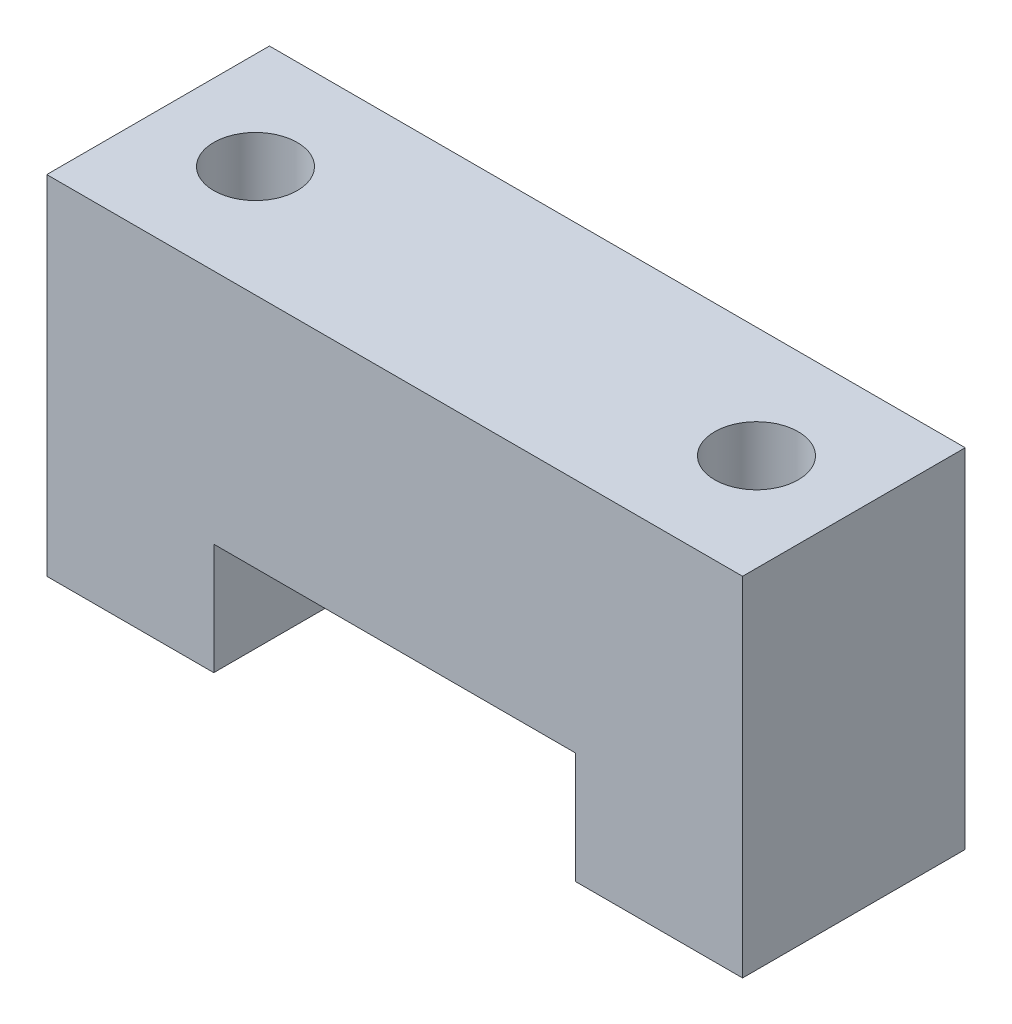
ISO-10303-21;
HEADER;
FILE_DESCRIPTION(('STEP AP214'),'2;1');
FILE_NAME('part.step','',(''),(''),'','','');
FILE_SCHEMA(('AUTOMOTIVE_DESIGN { 1 0 10303 214 1 1 1 1 }'));
ENDSEC;
DATA;
#1=APPLICATION_CONTEXT('core data for automotive mechanical design processes');
#2=APPLICATION_PROTOCOL_DEFINITION('international standard','automotive_design',2000,#1);
#3=PRODUCT_CONTEXT('',#1,'mechanical');
#4=PRODUCT('Part','Part','',(#3));
#5=PRODUCT_RELATED_PRODUCT_CATEGORY('part','',(#4));
#6=PRODUCT_DEFINITION_FORMATION('','',#4);
#7=PRODUCT_DEFINITION_CONTEXT('part definition',#1,'design');
#8=PRODUCT_DEFINITION('design','',#6,#7);
#9=PRODUCT_DEFINITION_SHAPE('','',#8);
#10=(LENGTH_UNIT() NAMED_UNIT(*) SI_UNIT(.MILLI.,.METRE.));
#11=(NAMED_UNIT(*) PLANE_ANGLE_UNIT() SI_UNIT($,.RADIAN.));
#12=(NAMED_UNIT(*) SI_UNIT($,.STERADIAN.) SOLID_ANGLE_UNIT());
#13=UNCERTAINTY_MEASURE_WITH_UNIT(LENGTH_MEASURE(1.E-05),#10,'distance_accuracy_value','');
#14=(GEOMETRIC_REPRESENTATION_CONTEXT(3) GLOBAL_UNCERTAINTY_ASSIGNED_CONTEXT((#13)) GLOBAL_UNIT_ASSIGNED_CONTEXT((#10,
#11,#12)) REPRESENTATION_CONTEXT('',''));
#15=CARTESIAN_POINT('',(0.,0.,0.));
#16=DIRECTION('',(0.,0.,1.));
#17=DIRECTION('',(1.,0.,0.));
#18=AXIS2_PLACEMENT_3D('',#15,#16,#17);
#19=CARTESIAN_POINT('',(0.,0.,0.));
#20=DIRECTION('',(0.,-1.,0.));
#21=DIRECTION('',(0.,0.,-1.));
#22=AXIS2_PLACEMENT_3D('',#19,#20,#21);
#23=PLANE('',#22);
#24=DIRECTION('',(0.,0.,-1.));
#25=VECTOR('',#24,1.);
#26=CARTESIAN_POINT('',(-13.,0.,0.));
#27=LINE('',#26,#25);
#28=CARTESIAN_POINT('',(-13.,0.,8.));
#29=VERTEX_POINT('',#28);
#30=CARTESIAN_POINT('',(-13.,0.,-8.));
#31=VERTEX_POINT('',#30);
#32=EDGE_CURVE('E11',#29,#31,#27,.T.);
#33=ORIENTED_EDGE('',*,*,#32,.F.);
#34=DIRECTION('',(1.,0.,0.));
#35=VECTOR('',#34,1.);
#36=CARTESIAN_POINT('',(-25.,0.,8.));
#37=LINE('',#36,#35);
#38=CARTESIAN_POINT('',(-25.,0.,8.));
#39=VERTEX_POINT('',#38);
#40=EDGE_CURVE('E146',#39,#29,#37,.T.);
#41=ORIENTED_EDGE('',*,*,#40,.F.);
#42=DIRECTION('',(0.,0.,1.));
#43=VECTOR('',#42,1.);
#44=CARTESIAN_POINT('',(-25.,0.,8.));
#45=LINE('',#44,#43);
#46=CARTESIAN_POINT('',(-25.,0.,-8.));
#47=VERTEX_POINT('',#46);
#48=EDGE_CURVE('E158',#47,#39,#45,.T.);
#49=ORIENTED_EDGE('',*,*,#48,.F.);
#50=DIRECTION('',(-1.,0.,0.));
#51=VECTOR('',#50,1.);
#52=CARTESIAN_POINT('',(-25.,0.,-8.));
#53=LINE('',#52,#51);
#54=EDGE_CURVE('E154',#31,#47,#53,.T.);
#55=ORIENTED_EDGE('',*,*,#54,.F.);
#56=EDGE_LOOP('',(#33,#41,#49,#55));
#57=FACE_BOUND('',#56,.T.);
#58=ADVANCED_FACE('F17',(#57),#23,.T.);
#59=CARTESIAN_POINT('',(25.,25.,8.));
#60=DIRECTION('',(-1.,0.,0.));
#61=DIRECTION('',(0.,0.,1.));
#62=AXIS2_PLACEMENT_3D('',#59,#60,#61);
#63=PLANE('',#62);
#64=DIRECTION('',(0.,0.,-1.));
#65=VECTOR('',#64,1.);
#66=CARTESIAN_POINT('',(25.,0.,8.));
#67=LINE('',#66,#65);
#68=CARTESIAN_POINT('',(25.,0.,8.));
#69=VERTEX_POINT('',#68);
#70=CARTESIAN_POINT('',(25.,0.,-8.));
#71=VERTEX_POINT('',#70);
#72=EDGE_CURVE('E141',#69,#71,#67,.T.);
#73=ORIENTED_EDGE('',*,*,#72,.T.);
#74=DIRECTION('',(0.,-1.,0.));
#75=VECTOR('',#74,1.);
#76=CARTESIAN_POINT('',(25.,25.,-8.));
#77=LINE('',#76,#75);
#78=CARTESIAN_POINT('',(25.,25.,-8.));
#79=VERTEX_POINT('',#78);
#80=EDGE_CURVE('E169',#79,#71,#77,.T.);
#81=ORIENTED_EDGE('',*,*,#80,.F.);
#82=DIRECTION('',(0.,0.,-1.));
#83=VECTOR('',#82,1.);
#84=CARTESIAN_POINT('',(25.,25.,8.));
#85=LINE('',#84,#83);
#86=CARTESIAN_POINT('',(25.,25.,8.));
#87=VERTEX_POINT('',#86);
#88=EDGE_CURVE('E144',#87,#79,#85,.T.);
#89=ORIENTED_EDGE('',*,*,#88,.F.);
#90=DIRECTION('',(0.,-1.,0.));
#91=VECTOR('',#90,1.);
#92=CARTESIAN_POINT('',(25.,25.,8.));
#93=LINE('',#92,#91);
#94=EDGE_CURVE('E151',#87,#69,#93,.T.);
#95=ORIENTED_EDGE('',*,*,#94,.T.);
#96=EDGE_LOOP('',(#73,#81,#89,#95));
#97=FACE_BOUND('',#96,.T.);
#98=ADVANCED_FACE('F19',(#97),#63,.F.);
#99=CARTESIAN_POINT('',(-25.,25.,-8.));
#100=DIRECTION('',(0.,0.,1.));
#101=DIRECTION('',(1.,0.,0.));
#102=AXIS2_PLACEMENT_3D('',#99,#100,#101);
#103=PLANE('',#102);
#104=DIRECTION('',(1.,0.,0.));
#105=VECTOR('',#104,1.);
#106=CARTESIAN_POINT('',(13.,8.,-8.));
#107=LINE('',#106,#105);
#108=CARTESIAN_POINT('',(-13.,8.,-8.));
#109=VERTEX_POINT('',#108);
#110=CARTESIAN_POINT('',(13.,8.,-8.));
#111=VERTEX_POINT('',#110);
#112=EDGE_CURVE('E135',#109,#111,#107,.T.);
#113=ORIENTED_EDGE('',*,*,#112,.F.);
#114=DIRECTION('',(0.,1.,0.));
#115=VECTOR('',#114,1.);
#116=CARTESIAN_POINT('',(-13.,8.,-8.));
#117=LINE('',#116,#115);
#118=EDGE_CURVE('E124',#31,#109,#117,.T.);
#119=ORIENTED_EDGE('',*,*,#118,.F.);
#120=ORIENTED_EDGE('',*,*,#54,.T.);
#121=DIRECTION('',(0.,-1.,0.));
#122=VECTOR('',#121,1.);
#123=CARTESIAN_POINT('',(-25.,25.,-8.));
#124=LINE('',#123,#122);
#125=CARTESIAN_POINT('',(-25.,25.,-8.));
#126=VERTEX_POINT('',#125);
#127=EDGE_CURVE('E166',#126,#47,#124,.T.);
#128=ORIENTED_EDGE('',*,*,#127,.F.);
#129=DIRECTION('',(-1.,0.,0.));
#130=VECTOR('',#129,1.);
#131=CARTESIAN_POINT('',(-25.,25.,-8.));
#132=LINE('',#131,#130);
#133=EDGE_CURVE('E70',#79,#126,#132,.T.);
#134=ORIENTED_EDGE('',*,*,#133,.F.);
#135=ORIENTED_EDGE('',*,*,#80,.T.);
#136=CARTESIAN_POINT('',(13.,0.,-8.));
#137=VERTEX_POINT('',#136);
#138=EDGE_CURVE('E155',#71,#137,#53,.T.);
#139=ORIENTED_EDGE('',*,*,#138,.T.);
#140=DIRECTION('',(0.,-1.,0.));
#141=VECTOR('',#140,1.);
#142=CARTESIAN_POINT('',(13.,8.,-8.));
#143=LINE('',#142,#141);
#144=EDGE_CURVE('E32',#111,#137,#143,.T.);
#145=ORIENTED_EDGE('',*,*,#144,.F.);
#146=EDGE_LOOP('',(#113,#119,#120,#128,#134,#135,#139,#145));
#147=FACE_BOUND('',#146,.T.);
#148=ADVANCED_FACE('F192',(#147),#103,.F.);
#149=CARTESIAN_POINT('',(-25.,25.,8.));
#150=DIRECTION('',(1.,0.,0.));
#151=DIRECTION('',(0.,0.,-1.));
#152=AXIS2_PLACEMENT_3D('',#149,#150,#151);
#153=PLANE('',#152);
#154=ORIENTED_EDGE('',*,*,#48,.T.);
#155=DIRECTION('',(0.,-1.,0.));
#156=VECTOR('',#155,1.);
#157=CARTESIAN_POINT('',(-25.,25.,8.));
#158=LINE('',#157,#156);
#159=CARTESIAN_POINT('',(-25.,25.,8.));
#160=VERTEX_POINT('',#159);
#161=EDGE_CURVE('E163',#160,#39,#158,.T.);
#162=ORIENTED_EDGE('',*,*,#161,.F.);
#163=DIRECTION('',(0.,0.,1.));
#164=VECTOR('',#163,1.);
#165=CARTESIAN_POINT('',(-25.,25.,8.));
#166=LINE('',#165,#164);
#167=EDGE_CURVE('E148',#126,#160,#166,.T.);
#168=ORIENTED_EDGE('',*,*,#167,.F.);
#169=ORIENTED_EDGE('',*,*,#127,.T.);
#170=EDGE_LOOP('',(#154,#162,#168,#169));
#171=FACE_BOUND('',#170,.T.);
#172=ADVANCED_FACE('F229',(#171),#153,.F.);
#173=CARTESIAN_POINT('',(-25.,25.,8.));
#174=DIRECTION('',(0.,0.,-1.));
#175=DIRECTION('',(-1.,0.,0.));
#176=AXIS2_PLACEMENT_3D('',#173,#174,#175);
#177=PLANE('',#176);
#178=ORIENTED_EDGE('',*,*,#40,.T.);
#179=DIRECTION('',(0.,1.,0.));
#180=VECTOR('',#179,1.);
#181=CARTESIAN_POINT('',(-13.,8.,8.));
#182=LINE('',#181,#180);
#183=CARTESIAN_POINT('',(-13.,8.,8.));
#184=VERTEX_POINT('',#183);
#185=EDGE_CURVE('E125',#29,#184,#182,.T.);
#186=ORIENTED_EDGE('',*,*,#185,.T.);
#187=DIRECTION('',(1.,0.,0.));
#188=VECTOR('',#187,1.);
#189=CARTESIAN_POINT('',(13.,8.,8.));
#190=LINE('',#189,#188);
#191=CARTESIAN_POINT('',(13.,8.,8.));
#192=VERTEX_POINT('',#191);
#193=EDGE_CURVE('E128',#184,#192,#190,.T.);
#194=ORIENTED_EDGE('',*,*,#193,.T.);
#195=DIRECTION('',(0.,-1.,0.));
#196=VECTOR('',#195,1.);
#197=CARTESIAN_POINT('',(13.,8.,8.));
#198=LINE('',#197,#196);
#199=CARTESIAN_POINT('',(13.,0.,8.));
#200=VERTEX_POINT('',#199);
#201=EDGE_CURVE('E131',#192,#200,#198,.T.);
#202=ORIENTED_EDGE('',*,*,#201,.T.);
#203=EDGE_CURVE('E62',#200,#69,#37,.T.);
#204=ORIENTED_EDGE('',*,*,#203,.T.);
#205=ORIENTED_EDGE('',*,*,#94,.F.);
#206=DIRECTION('',(1.,0.,0.));
#207=VECTOR('',#206,1.);
#208=CARTESIAN_POINT('',(-25.,25.,8.));
#209=LINE('',#208,#207);
#210=EDGE_CURVE('E41',#160,#87,#209,.T.);
#211=ORIENTED_EDGE('',*,*,#210,.F.);
#212=ORIENTED_EDGE('',*,*,#161,.T.);
#213=EDGE_LOOP('',(#178,#186,#194,#202,#204,#205,#211,#212));
#214=FACE_BOUND('',#213,.T.);
#215=ADVANCED_FACE('F173',(#214),#177,.F.);
#216=CARTESIAN_POINT('',(0.,25.,0.));
#217=DIRECTION('',(0.,-1.,0.));
#218=DIRECTION('',(0.,0.,-1.));
#219=AXIS2_PLACEMENT_3D('',#216,#217,#218);
#220=PLANE('',#219);
#221=CARTESIAN_POINT('',(18.,25.,0.));
#222=DIRECTION('',(0.,1.,0.));
#223=DIRECTION('',(0.,0.,1.));
#224=AXIS2_PLACEMENT_3D('',#221,#222,#223);
#225=CIRCLE('',#224,3.);
#226=CARTESIAN_POINT('',(18.,25.,3.00000000000003));
#227=VERTEX_POINT('',#226);
#228=EDGE_CURVE('E233',#227,#227,#225,.T.);
#229=ORIENTED_EDGE('',*,*,#228,.F.);
#230=EDGE_LOOP('',(#229));
#231=FACE_BOUND('',#230,.T.);
#232=CARTESIAN_POINT('',(-18.,25.,0.));
#233=DIRECTION('',(0.,1.,0.));
#234=DIRECTION('',(0.,0.,1.));
#235=AXIS2_PLACEMENT_3D('',#232,#233,#234);
#236=CIRCLE('',#235,3.);
#237=CARTESIAN_POINT('',(-18.,25.,3.00000000000003));
#238=VERTEX_POINT('',#237);
#239=EDGE_CURVE('E105',#238,#238,#236,.T.);
#240=ORIENTED_EDGE('',*,*,#239,.F.);
#241=EDGE_LOOP('',(#240));
#242=FACE_BOUND('',#241,.T.);
#243=ORIENTED_EDGE('',*,*,#88,.T.);
#244=ORIENTED_EDGE('',*,*,#133,.T.);
#245=ORIENTED_EDGE('',*,*,#167,.T.);
#246=ORIENTED_EDGE('',*,*,#210,.T.);
#247=EDGE_LOOP('',(#243,#244,#245,#246));
#248=FACE_BOUND('',#247,.T.);
#249=ADVANCED_FACE('F218',(#231,#242,#248),#220,.F.);
#250=DIRECTION('',(0.,0.,1.));
#251=VECTOR('',#250,1.);
#252=CARTESIAN_POINT('',(13.,0.,0.));
#253=LINE('',#252,#251);
#254=EDGE_CURVE('E25',#137,#200,#253,.T.);
#255=ORIENTED_EDGE('',*,*,#254,.F.);
#256=ORIENTED_EDGE('',*,*,#138,.F.);
#257=ORIENTED_EDGE('',*,*,#72,.F.);
#258=ORIENTED_EDGE('',*,*,#203,.F.);
#259=EDGE_LOOP('',(#255,#256,#257,#258));
#260=FACE_BOUND('',#259,.T.);
#261=ADVANCED_FACE('F176',(#260),#23,.T.);
#262=CARTESIAN_POINT('',(-13.,8.,8.));
#263=DIRECTION('',(-1.,0.,0.));
#264=DIRECTION('',(0.,0.,1.));
#265=AXIS2_PLACEMENT_3D('',#262,#263,#264);
#266=PLANE('',#265);
#267=ORIENTED_EDGE('',*,*,#32,.T.);
#268=ORIENTED_EDGE('',*,*,#118,.T.);
#269=DIRECTION('',(0.,0.,-1.));
#270=VECTOR('',#269,1.);
#271=CARTESIAN_POINT('',(-13.,8.,8.));
#272=LINE('',#271,#270);
#273=EDGE_CURVE('E133',#184,#109,#272,.T.);
#274=ORIENTED_EDGE('',*,*,#273,.F.);
#275=ORIENTED_EDGE('',*,*,#185,.F.);
#276=EDGE_LOOP('',(#267,#268,#274,#275));
#277=FACE_BOUND('',#276,.T.);
#278=ADVANCED_FACE('F190',(#277),#266,.F.);
#279=CARTESIAN_POINT('',(13.,8.,8.));
#280=DIRECTION('',(1.,0.,0.));
#281=DIRECTION('',(0.,0.,-1.));
#282=AXIS2_PLACEMENT_3D('',#279,#280,#281);
#283=PLANE('',#282);
#284=ORIENTED_EDGE('',*,*,#254,.T.);
#285=ORIENTED_EDGE('',*,*,#201,.F.);
#286=DIRECTION('',(0.,0.,-1.));
#287=VECTOR('',#286,1.);
#288=CARTESIAN_POINT('',(13.,8.,8.));
#289=LINE('',#288,#287);
#290=EDGE_CURVE('E139',#192,#111,#289,.T.);
#291=ORIENTED_EDGE('',*,*,#290,.T.);
#292=ORIENTED_EDGE('',*,*,#144,.T.);
#293=EDGE_LOOP('',(#284,#285,#291,#292));
#294=FACE_BOUND('',#293,.T.);
#295=ADVANCED_FACE('F171',(#294),#283,.F.);
#296=CARTESIAN_POINT('',(13.,8.,8.));
#297=DIRECTION('',(0.,1.,0.));
#298=DIRECTION('',(0.,0.,1.));
#299=AXIS2_PLACEMENT_3D('',#296,#297,#298);
#300=PLANE('',#299);
#301=ORIENTED_EDGE('',*,*,#112,.T.);
#302=ORIENTED_EDGE('',*,*,#290,.F.);
#303=ORIENTED_EDGE('',*,*,#193,.F.);
#304=ORIENTED_EDGE('',*,*,#273,.T.);
#305=EDGE_LOOP('',(#301,#302,#303,#304));
#306=FACE_BOUND('',#305,.T.);
#307=ADVANCED_FACE('F194',(#306),#300,.F.);
#308=CARTESIAN_POINT('',(-18.,10.,0.));
#309=DIRECTION('',(0.,1.,0.));
#310=DIRECTION('',(0.,0.,1.));
#311=AXIS2_PLACEMENT_3D('',#308,#309,#310);
#312=CONICAL_SURFACE('',#311,2.5,1.02974425867665);
#313=CARTESIAN_POINT('',(-18.,8.4978484524311,0.));
#314=VERTEX_POINT('',#313);
#315=VERTEX_LOOP('',#314);
#316=FACE_BOUND('',#315,.T.);
#317=CARTESIAN_POINT('',(-18.,10.,0.));
#318=DIRECTION('',(0.,1.,0.));
#319=DIRECTION('',(0.,0.,1.));
#320=AXIS2_PLACEMENT_3D('',#317,#318,#319);
#321=CIRCLE('',#320,2.5);
#322=CARTESIAN_POINT('',(-18.,10.,2.50000000000003));
#323=VERTEX_POINT('',#322);
#324=EDGE_CURVE('E121',#323,#323,#321,.T.);
#325=ORIENTED_EDGE('',*,*,#324,.T.);
#326=EDGE_LOOP('',(#325));
#327=FACE_BOUND('',#326,.T.);
#328=ADVANCED_FACE('F196',(#316,#327),#312,.F.);
#329=CARTESIAN_POINT('',(-18.,25.,0.));
#330=DIRECTION('',(0.,1.,0.));
#331=DIRECTION('',(0.,0.,1.));
#332=AXIS2_PLACEMENT_3D('',#329,#330,#331);
#333=CYLINDRICAL_SURFACE('',#332,2.5);
#334=ORIENTED_EDGE('',*,*,#324,.F.);
#335=EDGE_LOOP('',(#334));
#336=FACE_BOUND('',#335,.T.);
#337=CARTESIAN_POINT('',(-18.,13.,0.));
#338=DIRECTION('',(0.,1.,0.));
#339=DIRECTION('',(0.,0.,1.));
#340=AXIS2_PLACEMENT_3D('',#337,#338,#339);
#341=CIRCLE('',#340,2.5);
#342=CARTESIAN_POINT('',(-18.,13.,2.50000000000003));
#343=VERTEX_POINT('',#342);
#344=EDGE_CURVE('E118',#343,#343,#341,.T.);
#345=ORIENTED_EDGE('',*,*,#344,.T.);
#346=EDGE_LOOP('',(#345));
#347=FACE_BOUND('',#346,.T.);
#348=ADVANCED_FACE('F204',(#336,#347),#333,.F.);
#349=CARTESIAN_POINT('',(-15.5,13.,0.));
#350=DIRECTION('',(0.,-1.,0.));
#351=DIRECTION('',(0.,0.,-1.));
#352=AXIS2_PLACEMENT_3D('',#349,#350,#351);
#353=PLANE('',#352);
#354=ORIENTED_EDGE('',*,*,#344,.F.);
#355=EDGE_LOOP('',(#354));
#356=FACE_BOUND('',#355,.T.);
#357=CARTESIAN_POINT('',(-18.,13.,0.));
#358=DIRECTION('',(0.,1.,0.));
#359=DIRECTION('',(0.,0.,1.));
#360=AXIS2_PLACEMENT_3D('',#357,#358,#359);
#361=CIRCLE('',#360,3.);
#362=CARTESIAN_POINT('',(-18.,13.,3.00000000000003));
#363=VERTEX_POINT('',#362);
#364=EDGE_CURVE('E109',#363,#363,#361,.T.);
#365=ORIENTED_EDGE('',*,*,#364,.T.);
#366=EDGE_LOOP('',(#365));
#367=FACE_BOUND('',#366,.T.);
#368=ADVANCED_FACE('F319',(#356,#367),#353,.F.);
#369=CARTESIAN_POINT('',(-18.,25.,0.));
#370=DIRECTION('',(0.,1.,0.));
#371=DIRECTION('',(0.,0.,1.));
#372=AXIS2_PLACEMENT_3D('',#369,#370,#371);
#373=CYLINDRICAL_SURFACE('',#372,3.);
#374=ORIENTED_EDGE('',*,*,#364,.F.);
#375=EDGE_LOOP('',(#374));
#376=FACE_BOUND('',#375,.T.);
#377=ORIENTED_EDGE('',*,*,#239,.T.);
#378=EDGE_LOOP('',(#377));
#379=FACE_BOUND('',#378,.T.);
#380=ADVANCED_FACE('F99',(#376,#379),#373,.F.);
#381=CARTESIAN_POINT('',(18.,10.,0.));
#382=DIRECTION('',(0.,1.,0.));
#383=DIRECTION('',(0.,0.,1.));
#384=AXIS2_PLACEMENT_3D('',#381,#382,#383);
#385=CONICAL_SURFACE('',#384,2.5,1.02974425867665);
#386=CARTESIAN_POINT('',(18.,8.4978484524311,0.));
#387=VERTEX_POINT('',#386);
#388=VERTEX_LOOP('',#387);
#389=FACE_BOUND('',#388,.T.);
#390=CARTESIAN_POINT('',(18.,10.,0.));
#391=DIRECTION('',(0.,1.,0.));
#392=DIRECTION('',(0.,0.,1.));
#393=AXIS2_PLACEMENT_3D('',#390,#391,#392);
#394=CIRCLE('',#393,2.5);
#395=CARTESIAN_POINT('',(18.,10.,2.50000000000003));
#396=VERTEX_POINT('',#395);
#397=EDGE_CURVE('E103',#396,#396,#394,.T.);
#398=ORIENTED_EDGE('',*,*,#397,.T.);
#399=EDGE_LOOP('',(#398));
#400=FACE_BOUND('',#399,.T.);
#401=ADVANCED_FACE('F95',(#389,#400),#385,.F.);
#402=CARTESIAN_POINT('',(18.,25.,0.));
#403=DIRECTION('',(0.,1.,0.));
#404=DIRECTION('',(0.,0.,1.));
#405=AXIS2_PLACEMENT_3D('',#402,#403,#404);
#406=CYLINDRICAL_SURFACE('',#405,2.5);
#407=ORIENTED_EDGE('',*,*,#397,.F.);
#408=EDGE_LOOP('',(#407));
#409=FACE_BOUND('',#408,.T.);
#410=CARTESIAN_POINT('',(18.,13.,0.));
#411=DIRECTION('',(0.,1.,0.));
#412=DIRECTION('',(0.,0.,1.));
#413=AXIS2_PLACEMENT_3D('',#410,#411,#412);
#414=CIRCLE('',#413,2.5);
#415=CARTESIAN_POINT('',(18.,13.,2.50000000000003));
#416=VERTEX_POINT('',#415);
#417=EDGE_CURVE('E106',#416,#416,#414,.T.);
#418=ORIENTED_EDGE('',*,*,#417,.T.);
#419=EDGE_LOOP('',(#418));
#420=FACE_BOUND('',#419,.T.);
#421=ADVANCED_FACE('F98',(#409,#420),#406,.F.);
#422=CARTESIAN_POINT('',(20.5,13.,0.));
#423=DIRECTION('',(0.,-1.,0.));
#424=DIRECTION('',(0.,0.,-1.));
#425=AXIS2_PLACEMENT_3D('',#422,#423,#424);
#426=PLANE('',#425);
#427=ORIENTED_EDGE('',*,*,#417,.F.);
#428=EDGE_LOOP('',(#427));
#429=FACE_BOUND('',#428,.T.);
#430=CARTESIAN_POINT('',(18.,13.,0.));
#431=DIRECTION('',(0.,1.,0.));
#432=DIRECTION('',(0.,0.,1.));
#433=AXIS2_PLACEMENT_3D('',#430,#431,#432);
#434=CIRCLE('',#433,3.);
#435=CARTESIAN_POINT('',(18.,13.,3.00000000000003));
#436=VERTEX_POINT('',#435);
#437=EDGE_CURVE('E112',#436,#436,#434,.T.);
#438=ORIENTED_EDGE('',*,*,#437,.T.);
#439=EDGE_LOOP('',(#438));
#440=FACE_BOUND('',#439,.T.);
#441=ADVANCED_FACE('F292',(#429,#440),#426,.F.);
#442=CARTESIAN_POINT('',(18.,25.,0.));
#443=DIRECTION('',(0.,1.,0.));
#444=DIRECTION('',(0.,0.,1.));
#445=AXIS2_PLACEMENT_3D('',#442,#443,#444);
#446=CYLINDRICAL_SURFACE('',#445,3.);
#447=ORIENTED_EDGE('',*,*,#437,.F.);
#448=EDGE_LOOP('',(#447));
#449=FACE_BOUND('',#448,.T.);
#450=ORIENTED_EDGE('',*,*,#228,.T.);
#451=EDGE_LOOP('',(#450));
#452=FACE_BOUND('',#451,.T.);
#453=ADVANCED_FACE('F301',(#449,#452),#446,.F.);
#454=CLOSED_SHELL('',(#58,#98,#148,#172,#215,#249,#261,#278,#295,#307,#328,#348,#368,#380,#401,
#421,#441,#453));
#455=MANIFOLD_SOLID_BREP('B1',#454);
#456=ADVANCED_BREP_SHAPE_REPRESENTATION('',(#18,#455),#14);
#457=SHAPE_DEFINITION_REPRESENTATION(#9,#456);
ENDSEC;
END-ISO-10303-21;
